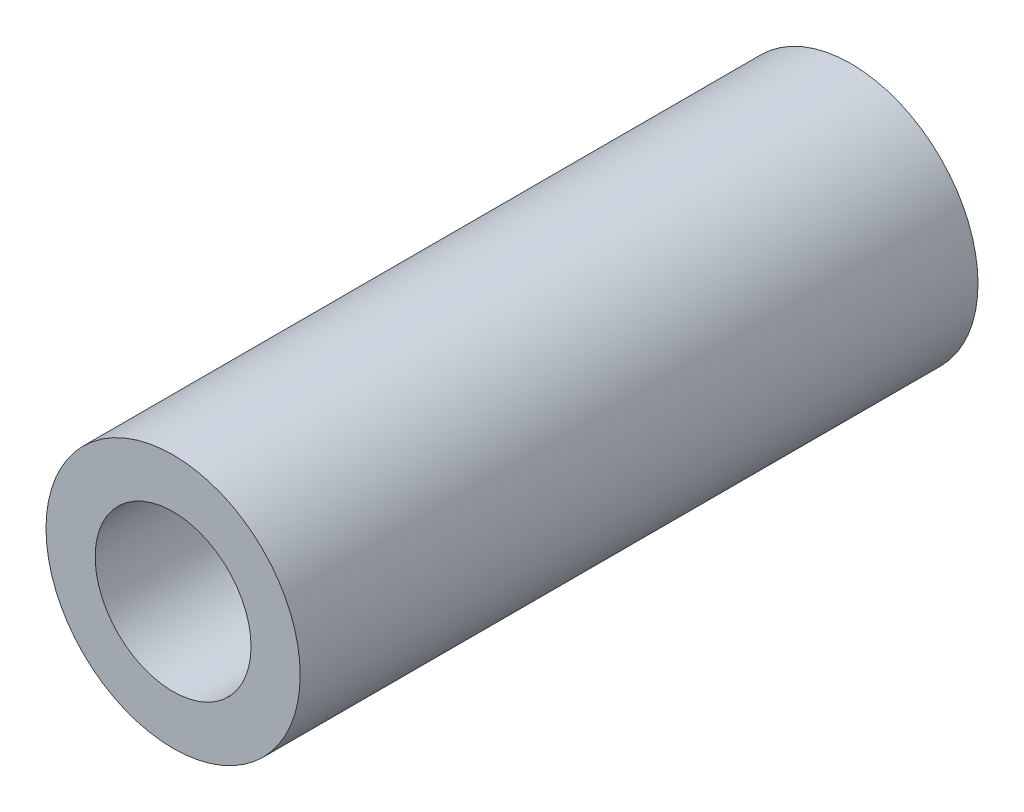
ISO-10303-21;
HEADER;
FILE_DESCRIPTION(('STEP AP214'),'2;1');
FILE_NAME('part.step','',(''),(''),'','','');
FILE_SCHEMA(('AUTOMOTIVE_DESIGN { 1 0 10303 214 1 1 1 1 }'));
ENDSEC;
DATA;
#1=APPLICATION_CONTEXT('core data for automotive mechanical design processes');
#2=APPLICATION_PROTOCOL_DEFINITION('international standard','automotive_design',2000,#1);
#3=PRODUCT_CONTEXT('',#1,'mechanical');
#4=PRODUCT('Part','Part','',(#3));
#5=PRODUCT_RELATED_PRODUCT_CATEGORY('part','',(#4));
#6=PRODUCT_DEFINITION_FORMATION('','',#4);
#7=PRODUCT_DEFINITION_CONTEXT('part definition',#1,'design');
#8=PRODUCT_DEFINITION('design','',#6,#7);
#9=PRODUCT_DEFINITION_SHAPE('','',#8);
#10=(LENGTH_UNIT() NAMED_UNIT(*) SI_UNIT(.MILLI.,.METRE.));
#11=(NAMED_UNIT(*) PLANE_ANGLE_UNIT() SI_UNIT($,.RADIAN.));
#12=(NAMED_UNIT(*) SI_UNIT($,.STERADIAN.) SOLID_ANGLE_UNIT());
#13=UNCERTAINTY_MEASURE_WITH_UNIT(LENGTH_MEASURE(1.E-05),#10,'distance_accuracy_value','');
#14=(GEOMETRIC_REPRESENTATION_CONTEXT(3) GLOBAL_UNCERTAINTY_ASSIGNED_CONTEXT((#13)) GLOBAL_UNIT_ASSIGNED_CONTEXT((#10,
#11,#12)) REPRESENTATION_CONTEXT('',''));
#15=CARTESIAN_POINT('',(0.,0.,0.));
#16=DIRECTION('',(0.,0.,1.));
#17=DIRECTION('',(1.,0.,0.));
#18=AXIS2_PLACEMENT_3D('',#15,#16,#17);
#19=CARTESIAN_POINT('',(0.,0.,6.35));
#20=DIRECTION('',(0.,0.,1.));
#21=DIRECTION('',(1.,0.,0.));
#22=AXIS2_PLACEMENT_3D('',#19,#20,#21);
#23=PLANE('',#22);
#24=CARTESIAN_POINT('',(0.,0.,6.35));
#25=DIRECTION('',(0.,0.,1.));
#26=DIRECTION('',(1.,0.,0.));
#27=AXIS2_PLACEMENT_3D('',#24,#25,#26);
#28=CIRCLE('',#27,2.38125);
#29=CARTESIAN_POINT('',(2.38125,0.,6.35));
#30=VERTEX_POINT('',#29);
#31=EDGE_CURVE('E10',#30,#30,#28,.T.);
#32=ORIENTED_EDGE('',*,*,#31,.T.);
#33=EDGE_LOOP('',(#32));
#34=FACE_BOUND('',#33,.T.);
#35=CARTESIAN_POINT('',(0.,0.,6.35));
#36=DIRECTION('',(0.,0.,1.));
#37=DIRECTION('',(1.,0.,0.));
#38=AXIS2_PLACEMENT_3D('',#35,#36,#37);
#39=CIRCLE('',#38,1.4605);
#40=CARTESIAN_POINT('',(1.4605,0.,6.35));
#41=VERTEX_POINT('',#40);
#42=EDGE_CURVE('E41',#41,#41,#39,.T.);
#43=ORIENTED_EDGE('',*,*,#42,.F.);
#44=EDGE_LOOP('',(#43));
#45=FACE_BOUND('',#44,.T.);
#46=ADVANCED_FACE('F30',(#34,#45),#23,.T.);
#47=CARTESIAN_POINT('',(0.,0.,-6.35));
#48=DIRECTION('',(0.,0.,1.));
#49=DIRECTION('',(1.,0.,0.));
#50=AXIS2_PLACEMENT_3D('',#47,#48,#49);
#51=PLANE('',#50);
#52=CARTESIAN_POINT('',(0.,0.,-6.35));
#53=DIRECTION('',(0.,0.,1.));
#54=DIRECTION('',(1.,0.,0.));
#55=AXIS2_PLACEMENT_3D('',#52,#53,#54);
#56=CIRCLE('',#55,2.38125);
#57=CARTESIAN_POINT('',(2.38125,0.,-6.35));
#58=VERTEX_POINT('',#57);
#59=EDGE_CURVE('E34',#58,#58,#56,.T.);
#60=ORIENTED_EDGE('',*,*,#59,.F.);
#61=EDGE_LOOP('',(#60));
#62=FACE_BOUND('',#61,.T.);
#63=CARTESIAN_POINT('',(0.,0.,-6.35));
#64=DIRECTION('',(0.,0.,1.));
#65=DIRECTION('',(1.,0.,0.));
#66=AXIS2_PLACEMENT_3D('',#63,#64,#65);
#67=CIRCLE('',#66,1.4605);
#68=CARTESIAN_POINT('',(1.4605,0.,-6.35));
#69=VERTEX_POINT('',#68);
#70=EDGE_CURVE('E43',#69,#69,#67,.T.);
#71=ORIENTED_EDGE('',*,*,#70,.T.);
#72=EDGE_LOOP('',(#71));
#73=FACE_BOUND('',#72,.T.);
#74=ADVANCED_FACE('F53',(#62,#73),#51,.F.);
#75=CARTESIAN_POINT('',(0.,0.,6.35));
#76=DIRECTION('',(0.,0.,-1.));
#77=DIRECTION('',(-1.,0.,0.));
#78=AXIS2_PLACEMENT_3D('',#75,#76,#77);
#79=CYLINDRICAL_SURFACE('',#78,2.38125);
#80=ORIENTED_EDGE('',*,*,#31,.F.);
#81=EDGE_LOOP('',(#80));
#82=FACE_BOUND('',#81,.T.);
#83=ORIENTED_EDGE('',*,*,#59,.T.);
#84=EDGE_LOOP('',(#83));
#85=FACE_BOUND('',#84,.T.);
#86=ADVANCED_FACE('F32',(#82,#85),#79,.T.);
#87=CARTESIAN_POINT('',(0.,0.,6.35));
#88=DIRECTION('',(0.,0.,-1.));
#89=DIRECTION('',(-1.,0.,0.));
#90=AXIS2_PLACEMENT_3D('',#87,#88,#89);
#91=CYLINDRICAL_SURFACE('',#90,1.4605);
#92=ORIENTED_EDGE('',*,*,#42,.T.);
#93=EDGE_LOOP('',(#92));
#94=FACE_BOUND('',#93,.T.);
#95=ORIENTED_EDGE('',*,*,#70,.F.);
#96=EDGE_LOOP('',(#95));
#97=FACE_BOUND('',#96,.T.);
#98=ADVANCED_FACE('F49',(#94,#97),#91,.F.);
#99=CLOSED_SHELL('',(#46,#74,#86,#98));
#100=MANIFOLD_SOLID_BREP('B2',#99);
#101=ADVANCED_BREP_SHAPE_REPRESENTATION('',(#18,#100),#14);
#102=SHAPE_DEFINITION_REPRESENTATION(#9,#101);
ENDSEC;
END-ISO-10303-21;
